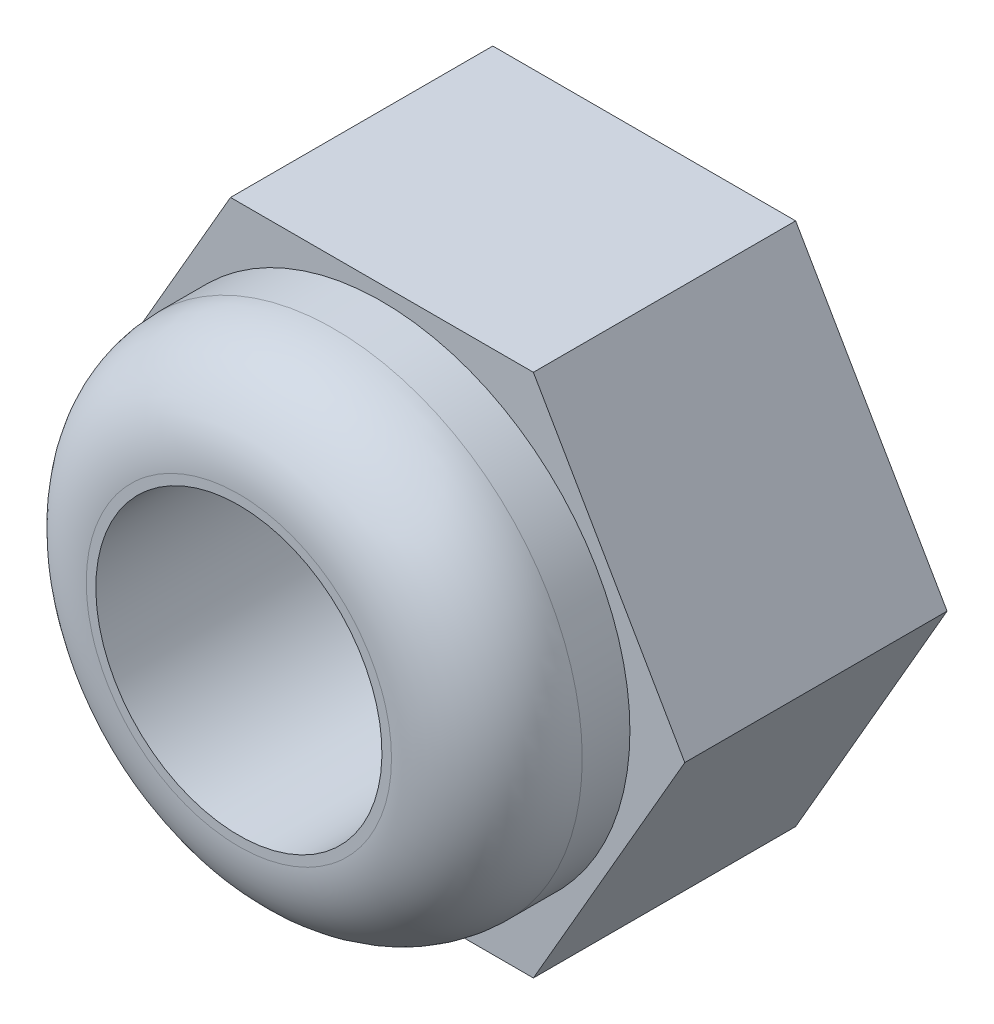
ISO-10303-21;
HEADER;
FILE_DESCRIPTION(('STEP AP214'),'2;1');
FILE_NAME('part.step','',(''),(''),'','','');
FILE_SCHEMA(('AUTOMOTIVE_DESIGN { 1 0 10303 214 1 1 1 1 }'));
ENDSEC;
DATA;
#1=APPLICATION_CONTEXT('core data for automotive mechanical design processes');
#2=APPLICATION_PROTOCOL_DEFINITION('international standard','automotive_design',2000,#1);
#3=PRODUCT_CONTEXT('',#1,'mechanical');
#4=PRODUCT('Part','Part','',(#3));
#5=PRODUCT_RELATED_PRODUCT_CATEGORY('part','',(#4));
#6=PRODUCT_DEFINITION_FORMATION('','',#4);
#7=PRODUCT_DEFINITION_CONTEXT('part definition',#1,'design');
#8=PRODUCT_DEFINITION('design','',#6,#7);
#9=PRODUCT_DEFINITION_SHAPE('','',#8);
#10=(LENGTH_UNIT() NAMED_UNIT(*) SI_UNIT(.MILLI.,.METRE.));
#11=(NAMED_UNIT(*) PLANE_ANGLE_UNIT() SI_UNIT($,.RADIAN.));
#12=(NAMED_UNIT(*) SI_UNIT($,.STERADIAN.) SOLID_ANGLE_UNIT());
#13=UNCERTAINTY_MEASURE_WITH_UNIT(LENGTH_MEASURE(1.E-05),#10,'distance_accuracy_value','');
#14=(GEOMETRIC_REPRESENTATION_CONTEXT(3) GLOBAL_UNCERTAINTY_ASSIGNED_CONTEXT((#13)) GLOBAL_UNIT_ASSIGNED_CONTEXT((#10,
#11,#12)) REPRESENTATION_CONTEXT('',''));
#15=CARTESIAN_POINT('',(0.,0.,0.));
#16=DIRECTION('',(0.,0.,1.));
#17=DIRECTION('',(1.,0.,0.));
#18=AXIS2_PLACEMENT_3D('',#15,#16,#17);
#19=CARTESIAN_POINT('',(0.,0.,2.75));
#20=DIRECTION('',(0.,0.,1.));
#21=DIRECTION('',(1.,0.,0.));
#22=AXIS2_PLACEMENT_3D('',#19,#20,#21);
#23=PLANE('',#22);
#24=CARTESIAN_POINT('',(0.,0.,2.75));
#25=DIRECTION('',(0.,0.,1.));
#26=DIRECTION('',(1.,0.,0.));
#27=AXIS2_PLACEMENT_3D('',#24,#25,#26);
#28=CIRCLE('',#27,2.6);
#29=CARTESIAN_POINT('',(2.6,0.,2.75));
#30=VERTEX_POINT('',#29);
#31=EDGE_CURVE('E21',#30,#30,#28,.T.);
#32=ORIENTED_EDGE('',*,*,#31,.F.);
#33=EDGE_LOOP('',(#32));
#34=FACE_BOUND('',#33,.T.);
#35=DIRECTION('',(-0.500000000000001,0.866025403784438,0.));
#36=VECTOR('',#35,1.);
#37=CARTESIAN_POINT('',(3.17542648054294,0.,2.75));
#38=LINE('',#37,#36);
#39=CARTESIAN_POINT('',(1.58771324027147,2.75,2.75));
#40=VERTEX_POINT('',#39);
#41=CARTESIAN_POINT('',(3.17542648054294,0.,2.75));
#42=VERTEX_POINT('',#41);
#43=EDGE_CURVE('E124',#40,#42,#38,.F.);
#44=ORIENTED_EDGE('',*,*,#43,.F.);
#45=DIRECTION('',(-1.,0.,0.));
#46=VECTOR('',#45,1.);
#47=CARTESIAN_POINT('',(1.58771324027147,2.75,2.75));
#48=LINE('',#47,#46);
#49=CARTESIAN_POINT('',(-1.58771324027147,2.75,2.75));
#50=VERTEX_POINT('',#49);
#51=EDGE_CURVE('E120',#50,#40,#48,.F.);
#52=ORIENTED_EDGE('',*,*,#51,.F.);
#53=DIRECTION('',(-0.499999999999999,-0.866025403784439,0.));
#54=VECTOR('',#53,1.);
#55=CARTESIAN_POINT('',(-1.58771324027147,2.75,2.75));
#56=LINE('',#55,#54);
#57=CARTESIAN_POINT('',(-3.17542648054294,0.,2.75));
#58=VERTEX_POINT('',#57);
#59=EDGE_CURVE('E81',#58,#50,#56,.F.);
#60=ORIENTED_EDGE('',*,*,#59,.F.);
#61=DIRECTION('',(0.500000000000001,-0.866025403784438,0.));
#62=VECTOR('',#61,1.);
#63=CARTESIAN_POINT('',(-3.17542648054294,0.,2.75));
#64=LINE('',#63,#62);
#65=CARTESIAN_POINT('',(-1.58771324027147,-2.75,2.75));
#66=VERTEX_POINT('',#65);
#67=EDGE_CURVE('E114',#66,#58,#64,.F.);
#68=ORIENTED_EDGE('',*,*,#67,.F.);
#69=DIRECTION('',(1.,0.,0.));
#70=VECTOR('',#69,1.);
#71=CARTESIAN_POINT('',(-1.58771324027147,-2.75,2.75));
#72=LINE('',#71,#70);
#73=CARTESIAN_POINT('',(1.58771324027147,-2.75,2.75));
#74=VERTEX_POINT('',#73);
#75=EDGE_CURVE('E130',#74,#66,#72,.F.);
#76=ORIENTED_EDGE('',*,*,#75,.F.);
#77=DIRECTION('',(0.5,0.866025403784439,0.));
#78=VECTOR('',#77,1.);
#79=CARTESIAN_POINT('',(1.58771324027147,-2.75,2.75));
#80=LINE('',#79,#78);
#81=EDGE_CURVE('E128',#42,#74,#80,.F.);
#82=ORIENTED_EDGE('',*,*,#81,.F.);
#83=EDGE_LOOP('',(#44,#52,#60,#68,#76,#82));
#84=FACE_BOUND('',#83,.T.);
#85=ADVANCED_FACE('F17',(#34,#84),#23,.T.);
#86=CARTESIAN_POINT('',(0.,0.,2.75));
#87=DIRECTION('',(0.,0.,1.));
#88=DIRECTION('',(1.,0.,0.));
#89=AXIS2_PLACEMENT_3D('',#86,#87,#88);
#90=CYLINDRICAL_SURFACE('',#89,2.6);
#91=ORIENTED_EDGE('',*,*,#31,.T.);
#92=EDGE_LOOP('',(#91));
#93=FACE_BOUND('',#92,.T.);
#94=CARTESIAN_POINT('',(0.,0.,3.25));
#95=DIRECTION('',(0.,0.,1.));
#96=DIRECTION('',(0.,-1.,0.));
#97=AXIS2_PLACEMENT_3D('',#94,#95,#96);
#98=CIRCLE('',#97,2.6);
#99=CARTESIAN_POINT('',(0.,-2.6,3.25));
#100=VERTEX_POINT('',#99);
#101=EDGE_CURVE('E111',#100,#100,#98,.T.);
#102=ORIENTED_EDGE('',*,*,#101,.F.);
#103=EDGE_LOOP('',(#102));
#104=FACE_BOUND('',#103,.T.);
#105=ADVANCED_FACE('F174',(#93,#104),#90,.T.);
#106=CARTESIAN_POINT('',(-1.58771324027147,-2.75,0.));
#107=DIRECTION('',(0.,-1.,0.));
#108=DIRECTION('',(1.,0.,0.));
#109=AXIS2_PLACEMENT_3D('',#106,#107,#108);
#110=PLANE('',#109);
#111=ORIENTED_EDGE('',*,*,#75,.T.);
#112=DIRECTION('',(0.,0.,1.));
#113=VECTOR('',#112,1.);
#114=CARTESIAN_POINT('',(-1.58771324027147,-2.75,0.));
#115=LINE('',#114,#113);
#116=CARTESIAN_POINT('',(-1.58771324027147,-2.75,0.));
#117=VERTEX_POINT('',#116);
#118=EDGE_CURVE('E85',#117,#66,#115,.T.);
#119=ORIENTED_EDGE('',*,*,#118,.F.);
#120=DIRECTION('',(1.,0.,0.));
#121=VECTOR('',#120,1.);
#122=CARTESIAN_POINT('',(0.,-2.75,0.));
#123=LINE('',#122,#121);
#124=CARTESIAN_POINT('',(1.58771324027147,-2.75,0.));
#125=VERTEX_POINT('',#124);
#126=EDGE_CURVE('E108',#117,#125,#123,.T.);
#127=ORIENTED_EDGE('',*,*,#126,.T.);
#128=DIRECTION('',(0.,0.,1.));
#129=VECTOR('',#128,1.);
#130=CARTESIAN_POINT('',(1.58771324027147,-2.75,0.));
#131=LINE('',#130,#129);
#132=EDGE_CURVE('E126',#74,#125,#131,.F.);
#133=ORIENTED_EDGE('',*,*,#132,.F.);
#134=EDGE_LOOP('',(#111,#119,#127,#133));
#135=FACE_BOUND('',#134,.T.);
#136=ADVANCED_FACE('F170',(#135),#110,.T.);
#137=CARTESIAN_POINT('',(1.58771324027147,-2.75,0.));
#138=DIRECTION('',(0.866025403784439,-0.5,0.));
#139=DIRECTION('',(0.5,0.866025403784439,0.));
#140=AXIS2_PLACEMENT_3D('',#137,#138,#139);
#141=PLANE('',#140);
#142=ORIENTED_EDGE('',*,*,#81,.T.);
#143=ORIENTED_EDGE('',*,*,#132,.T.);
#144=DIRECTION('',(0.5,0.866025403784439,0.));
#145=VECTOR('',#144,1.);
#146=CARTESIAN_POINT('',(1.58771324027147,-2.75,0.));
#147=LINE('',#146,#145);
#148=CARTESIAN_POINT('',(3.17542648054294,0.,0.));
#149=VERTEX_POINT('',#148);
#150=EDGE_CURVE('E102',#125,#149,#147,.T.);
#151=ORIENTED_EDGE('',*,*,#150,.T.);
#152=DIRECTION('',(0.,0.,1.));
#153=VECTOR('',#152,1.);
#154=CARTESIAN_POINT('',(3.17542648054294,0.,0.));
#155=LINE('',#154,#153);
#156=EDGE_CURVE('E122',#42,#149,#155,.F.);
#157=ORIENTED_EDGE('',*,*,#156,.F.);
#158=EDGE_LOOP('',(#142,#143,#151,#157));
#159=FACE_BOUND('',#158,.T.);
#160=ADVANCED_FACE('F166',(#159),#141,.T.);
#161=CARTESIAN_POINT('',(3.17542648054294,0.,0.));
#162=DIRECTION('',(0.866025403784438,0.500000000000001,0.));
#163=DIRECTION('',(-0.500000000000001,0.866025403784438,0.));
#164=AXIS2_PLACEMENT_3D('',#161,#162,#163);
#165=PLANE('',#164);
#166=ORIENTED_EDGE('',*,*,#43,.T.);
#167=ORIENTED_EDGE('',*,*,#156,.T.);
#168=DIRECTION('',(-0.500000000000001,0.866025403784438,0.));
#169=VECTOR('',#168,1.);
#170=CARTESIAN_POINT('',(3.17542648054294,0.,0.));
#171=LINE('',#170,#169);
#172=CARTESIAN_POINT('',(1.58771324027147,2.75,0.));
#173=VERTEX_POINT('',#172);
#174=EDGE_CURVE('E100',#149,#173,#171,.T.);
#175=ORIENTED_EDGE('',*,*,#174,.T.);
#176=DIRECTION('',(0.,0.,1.));
#177=VECTOR('',#176,1.);
#178=CARTESIAN_POINT('',(1.58771324027147,2.75,0.));
#179=LINE('',#178,#177);
#180=EDGE_CURVE('E99',#40,#173,#179,.F.);
#181=ORIENTED_EDGE('',*,*,#180,.F.);
#182=EDGE_LOOP('',(#166,#167,#175,#181));
#183=FACE_BOUND('',#182,.T.);
#184=ADVANCED_FACE('F163',(#183),#165,.T.);
#185=CARTESIAN_POINT('',(1.58771324027147,2.75,0.));
#186=DIRECTION('',(0.,1.,0.));
#187=DIRECTION('',(-1.,0.,0.));
#188=AXIS2_PLACEMENT_3D('',#185,#186,#187);
#189=PLANE('',#188);
#190=ORIENTED_EDGE('',*,*,#51,.T.);
#191=ORIENTED_EDGE('',*,*,#180,.T.);
#192=DIRECTION('',(1.,0.,0.));
#193=VECTOR('',#192,1.);
#194=CARTESIAN_POINT('',(0.,2.75,0.));
#195=LINE('',#194,#193);
#196=CARTESIAN_POINT('',(-1.58771324027147,2.75,0.));
#197=VERTEX_POINT('',#196);
#198=EDGE_CURVE('E92',#173,#197,#195,.F.);
#199=ORIENTED_EDGE('',*,*,#198,.T.);
#200=DIRECTION('',(0.,0.,1.));
#201=VECTOR('',#200,1.);
#202=CARTESIAN_POINT('',(-1.58771324027147,2.75,0.));
#203=LINE('',#202,#201);
#204=EDGE_CURVE('E75',#50,#197,#203,.F.);
#205=ORIENTED_EDGE('',*,*,#204,.F.);
#206=EDGE_LOOP('',(#190,#191,#199,#205));
#207=FACE_BOUND('',#206,.T.);
#208=ADVANCED_FACE('F97',(#207),#189,.T.);
#209=CARTESIAN_POINT('',(-1.58771324027147,2.75,0.));
#210=DIRECTION('',(-0.866025403784439,0.499999999999999,0.));
#211=DIRECTION('',(-0.499999999999999,-0.866025403784439,0.));
#212=AXIS2_PLACEMENT_3D('',#209,#210,#211);
#213=PLANE('',#212);
#214=ORIENTED_EDGE('',*,*,#59,.T.);
#215=ORIENTED_EDGE('',*,*,#204,.T.);
#216=DIRECTION('',(-0.499999999999999,-0.866025403784439,0.));
#217=VECTOR('',#216,1.);
#218=CARTESIAN_POINT('',(-1.58771324027147,2.75,0.));
#219=LINE('',#218,#217);
#220=CARTESIAN_POINT('',(-3.17542648054294,0.,0.));
#221=VERTEX_POINT('',#220);
#222=EDGE_CURVE('E79',#197,#221,#219,.T.);
#223=ORIENTED_EDGE('',*,*,#222,.T.);
#224=DIRECTION('',(0.,0.,1.));
#225=VECTOR('',#224,1.);
#226=CARTESIAN_POINT('',(-3.17542648054294,0.,0.));
#227=LINE('',#226,#225);
#228=EDGE_CURVE('E112',#58,#221,#227,.F.);
#229=ORIENTED_EDGE('',*,*,#228,.F.);
#230=EDGE_LOOP('',(#214,#215,#223,#229));
#231=FACE_BOUND('',#230,.T.);
#232=ADVANCED_FACE('F77',(#231),#213,.T.);
#233=CARTESIAN_POINT('',(-3.17542648054294,0.,0.));
#234=DIRECTION('',(-0.866025403784438,-0.500000000000001,0.));
#235=DIRECTION('',(0.500000000000001,-0.866025403784438,0.));
#236=AXIS2_PLACEMENT_3D('',#233,#234,#235);
#237=PLANE('',#236);
#238=ORIENTED_EDGE('',*,*,#67,.T.);
#239=ORIENTED_EDGE('',*,*,#228,.T.);
#240=DIRECTION('',(0.500000000000001,-0.866025403784438,0.));
#241=VECTOR('',#240,1.);
#242=CARTESIAN_POINT('',(-3.17542648054294,0.,0.));
#243=LINE('',#242,#241);
#244=EDGE_CURVE('E95',#221,#117,#243,.T.);
#245=ORIENTED_EDGE('',*,*,#244,.T.);
#246=ORIENTED_EDGE('',*,*,#118,.T.);
#247=EDGE_LOOP('',(#238,#239,#245,#246));
#248=FACE_BOUND('',#247,.T.);
#249=ADVANCED_FACE('F155',(#248),#237,.T.);
#250=CARTESIAN_POINT('',(0.,0.,3.25));
#251=DIRECTION('',(0.,0.,1.));
#252=DIRECTION('',(0.,-1.,0.));
#253=AXIS2_PLACEMENT_3D('',#250,#251,#252);
#254=TOROIDAL_SURFACE('',#253,1.6,1.);
#255=ORIENTED_EDGE('',*,*,#101,.T.);
#256=EDGE_LOOP('',(#255));
#257=FACE_BOUND('',#256,.T.);
#258=CARTESIAN_POINT('',(-1.6,0.,4.25));
#259=CARTESIAN_POINT('',(-1.6,-0.304705315228906,4.25));
#260=CARTESIAN_POINT('',(-1.48766128169989,-0.588951535298994,4.25));
#261=CARTESIAN_POINT('',(-1.36622613380774,-0.896214091738205,4.25));
#262=CARTESIAN_POINT('',(-1.13137084989848,-1.13137084989847,4.25));
#263=CARTESIAN_POINT('',(-0.897956014889855,-1.36508531011198,4.25));
#264=CARTESIAN_POINT('',(-0.588951535299005,-1.48766128169989,4.25));
#265=CARTESIAN_POINT('',(-0.306248267828686,-1.59980408211214,4.25));
#266=CARTESIAN_POINT('',(0.,-1.6,4.25));
#267=CARTESIAN_POINT('',(0.304212890730209,-1.60019461578488,4.25));
#268=CARTESIAN_POINT('',(0.588951535298992,-1.48766128169989,4.25));
#269=CARTESIAN_POINT('',(0.896214094658247,-1.36622613089151,4.25));
#270=CARTESIAN_POINT('',(1.13137084989847,-1.13137084989848,4.25));
#271=CARTESIAN_POINT('',(1.36508499852753,-0.897956326074776,4.25));
#272=CARTESIAN_POINT('',(1.48766128169989,-0.588951535298999,4.25));
#273=CARTESIAN_POINT('',(1.6,-0.305754808771288,4.25));
#274=CARTESIAN_POINT('',(1.6,0.,4.25));
#275=B_SPLINE_CURVE_WITH_KNOTS('',2,(#258,#259,#260,#261,#262,#263,#264,#265,#266,#267,#268,
#269,#270,#271,#272,#273,#274),.UNSPECIFIED.,.F.,.F.,(3,2,2,2,2,2,2,2,3),(0.,0.125,0.25,0.375,
0.5,0.625,0.75,0.875,1.),.UNSPECIFIED.);
#276=CARTESIAN_POINT('',(-1.6,0.,4.25));
#277=VERTEX_POINT('',#276);
#278=CARTESIAN_POINT('',(1.6,0.,4.25));
#279=VERTEX_POINT('',#278);
#280=EDGE_CURVE('E36',#277,#279,#275,.T.);
#281=ORIENTED_EDGE('',*,*,#280,.F.);
#282=CARTESIAN_POINT('',(1.6,0.,4.25));
#283=CARTESIAN_POINT('',(1.6,0.304705315230422,4.25));
#284=CARTESIAN_POINT('',(1.48766128169989,0.588951535299003,4.25));
#285=CARTESIAN_POINT('',(1.36622613380666,0.89621409173928,4.25));
#286=CARTESIAN_POINT('',(1.13137084989847,1.13137084989849,4.25));
#287=CARTESIAN_POINT('',(0.897956014890201,1.36508531011163,4.25));
#288=CARTESIAN_POINT('',(0.588951535298981,1.48766128169989,4.25));
#289=CARTESIAN_POINT('',(0.306248267829496,1.59980408211201,4.25));
#290=CARTESIAN_POINT('',(0.,1.6,4.25));
#291=CARTESIAN_POINT('',(-0.304212890730358,1.60019461578501,4.25));
#292=CARTESIAN_POINT('',(-0.588951535299009,1.48766128169988,4.25));
#293=CARTESIAN_POINT('',(-0.896214094658814,1.36622613089109,4.25));
#294=CARTESIAN_POINT('',(-1.13137084989848,1.13137084989847,4.25));
#295=CARTESIAN_POINT('',(-1.36508499852733,0.897956326074835,4.25));
#296=CARTESIAN_POINT('',(-1.48766128169989,0.588951535298992,4.25));
#297=CARTESIAN_POINT('',(-1.6,0.305754808771696,4.25));
#298=CARTESIAN_POINT('',(-1.6,0.,4.25));
#299=B_SPLINE_CURVE_WITH_KNOTS('',2,(#282,#283,#284,#285,#286,#287,#288,#289,#290,#291,#292,
#293,#294,#295,#296,#297,#298),.UNSPECIFIED.,.F.,.F.,(3,2,2,2,2,2,2,2,3),(0.,0.125,0.25,0.375,
0.5,0.625,0.75,0.875,1.),.UNSPECIFIED.);
#300=EDGE_CURVE('E33',#279,#277,#299,.T.);
#301=ORIENTED_EDGE('',*,*,#300,.F.);
#302=EDGE_LOOP('',(#281,#301));
#303=FACE_BOUND('',#302,.T.);
#304=ADVANCED_FACE('F19',(#257,#303),#254,.T.);
#305=CARTESIAN_POINT('',(0.,0.,0.));
#306=DIRECTION('',(0.,0.,1.));
#307=DIRECTION('',(1.,0.,0.));
#308=AXIS2_PLACEMENT_3D('',#305,#306,#307);
#309=PLANE('',#308);
#310=CARTESIAN_POINT('',(0.,0.,0.));
#311=DIRECTION('',(0.,0.,-1.));
#312=DIRECTION('',(0.,1.,0.));
#313=AXIS2_PLACEMENT_3D('',#310,#311,#312);
#314=CIRCLE('',#313,1.49999999999998);
#315=CARTESIAN_POINT('',(0.,1.49999999999999,0.));
#316=VERTEX_POINT('',#315);
#317=EDGE_CURVE('E26',#316,#316,#314,.F.);
#318=ORIENTED_EDGE('',*,*,#317,.T.);
#319=EDGE_LOOP('',(#318));
#320=FACE_BOUND('',#319,.T.);
#321=ORIENTED_EDGE('',*,*,#222,.F.);
#322=ORIENTED_EDGE('',*,*,#198,.F.);
#323=ORIENTED_EDGE('',*,*,#174,.F.);
#324=ORIENTED_EDGE('',*,*,#150,.F.);
#325=ORIENTED_EDGE('',*,*,#126,.F.);
#326=ORIENTED_EDGE('',*,*,#244,.F.);
#327=EDGE_LOOP('',(#321,#322,#323,#324,#325,#326));
#328=FACE_BOUND('',#327,.T.);
#329=ADVANCED_FACE('F90',(#320,#328),#309,.F.);
#330=CARTESIAN_POINT('',(0.,0.,4.25));
#331=DIRECTION('',(0.,0.,1.));
#332=DIRECTION('',(1.,0.,0.));
#333=AXIS2_PLACEMENT_3D('',#330,#331,#332);
#334=PLANE('',#333);
#335=ORIENTED_EDGE('',*,*,#300,.T.);
#336=ORIENTED_EDGE('',*,*,#280,.T.);
#337=EDGE_LOOP('',(#335,#336));
#338=FACE_BOUND('',#337,.T.);
#339=CARTESIAN_POINT('',(0.,0.,4.25));
#340=DIRECTION('',(0.,0.,-1.));
#341=DIRECTION('',(0.,1.,0.));
#342=AXIS2_PLACEMENT_3D('',#339,#340,#341);
#343=CIRCLE('',#342,1.49999999999998);
#344=CARTESIAN_POINT('',(0.,1.49999999999999,4.25));
#345=VERTEX_POINT('',#344);
#346=EDGE_CURVE('E11',#345,#345,#343,.T.);
#347=ORIENTED_EDGE('',*,*,#346,.T.);
#348=EDGE_LOOP('',(#347));
#349=FACE_BOUND('',#348,.T.);
#350=ADVANCED_FACE('F141',(#338,#349),#334,.T.);
#351=CARTESIAN_POINT('',(0.,0.,0.));
#352=DIRECTION('',(0.,0.,-1.));
#353=DIRECTION('',(0.,1.,0.));
#354=AXIS2_PLACEMENT_3D('',#351,#352,#353);
#355=CYLINDRICAL_SURFACE('',#354,1.49999999999998);
#356=ORIENTED_EDGE('',*,*,#317,.F.);
#357=EDGE_LOOP('',(#356));
#358=FACE_BOUND('',#357,.T.);
#359=ORIENTED_EDGE('',*,*,#346,.F.);
#360=EDGE_LOOP('',(#359));
#361=FACE_BOUND('',#360,.T.);
#362=ADVANCED_FACE('F151',(#358,#361),#355,.F.);
#363=CLOSED_SHELL('',(#85,#105,#136,#160,#184,#208,#232,#249,#304,#329,#350,#362));
#364=MANIFOLD_SOLID_BREP('B1',#363);
#365=ADVANCED_BREP_SHAPE_REPRESENTATION('',(#18,#364),#14);
#366=SHAPE_DEFINITION_REPRESENTATION(#9,#365);
ENDSEC;
END-ISO-10303-21;
